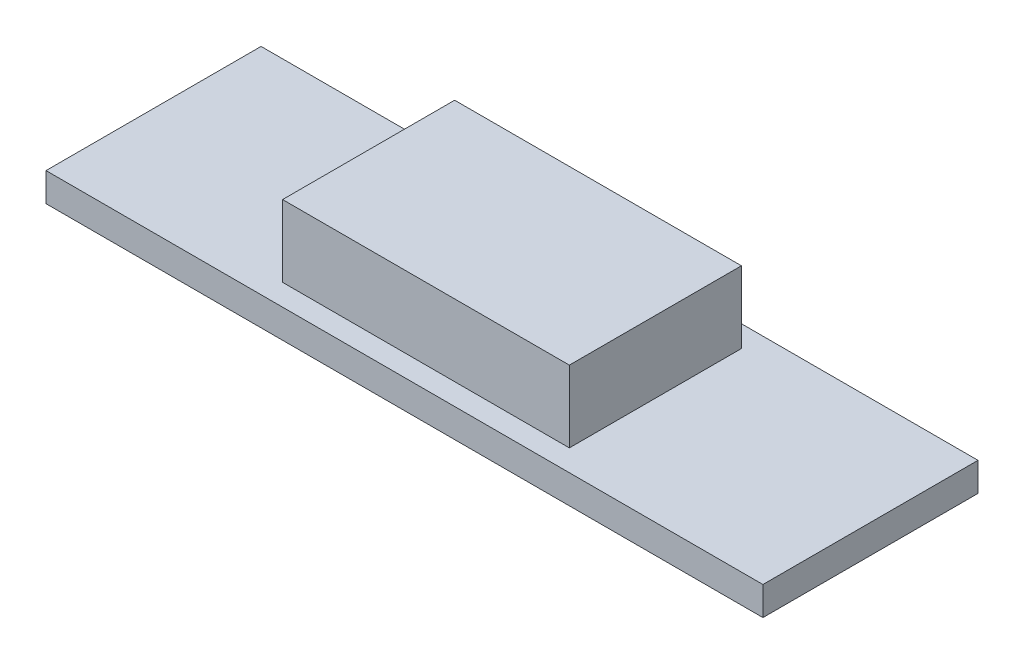
ISO-10303-21;
HEADER;
FILE_DESCRIPTION(('STEP AP214'),'2;1');
FILE_NAME('part.step','',(''),(''),'','','');
FILE_SCHEMA(('AUTOMOTIVE_DESIGN { 1 0 10303 214 1 1 1 1 }'));
ENDSEC;
DATA;
#1=APPLICATION_CONTEXT('core data for automotive mechanical design processes');
#2=APPLICATION_PROTOCOL_DEFINITION('international standard','automotive_design',2000,#1);
#3=PRODUCT_CONTEXT('',#1,'mechanical');
#4=PRODUCT('Part','Part','',(#3));
#5=PRODUCT_RELATED_PRODUCT_CATEGORY('part','',(#4));
#6=PRODUCT_DEFINITION_FORMATION('','',#4);
#7=PRODUCT_DEFINITION_CONTEXT('part definition',#1,'design');
#8=PRODUCT_DEFINITION('design','',#6,#7);
#9=PRODUCT_DEFINITION_SHAPE('','',#8);
#10=(LENGTH_UNIT() NAMED_UNIT(*) SI_UNIT(.MILLI.,.METRE.));
#11=(NAMED_UNIT(*) PLANE_ANGLE_UNIT() SI_UNIT($,.RADIAN.));
#12=(NAMED_UNIT(*) SI_UNIT($,.STERADIAN.) SOLID_ANGLE_UNIT());
#13=UNCERTAINTY_MEASURE_WITH_UNIT(LENGTH_MEASURE(1.E-05),#10,'distance_accuracy_value','');
#14=(GEOMETRIC_REPRESENTATION_CONTEXT(3) GLOBAL_UNCERTAINTY_ASSIGNED_CONTEXT((#13)) GLOBAL_UNIT_ASSIGNED_CONTEXT((#10,
#11,#12)) REPRESENTATION_CONTEXT('',''));
#15=CARTESIAN_POINT('',(0.,0.,0.));
#16=DIRECTION('',(0.,0.,1.));
#17=DIRECTION('',(1.,0.,0.));
#18=AXIS2_PLACEMENT_3D('',#15,#16,#17);
#19=CARTESIAN_POINT('',(-10.,5.,6.));
#20=DIRECTION('',(1.,0.,0.));
#21=DIRECTION('',(0.,0.,-1.));
#22=AXIS2_PLACEMENT_3D('',#19,#20,#21);
#23=PLANE('',#22);
#24=DIRECTION('',(0.,0.,1.));
#25=VECTOR('',#24,1.);
#26=CARTESIAN_POINT('',(-10.,0.,6.));
#27=LINE('',#26,#25);
#28=CARTESIAN_POINT('',(-10.,0.,-6.));
#29=VERTEX_POINT('',#28);
#30=CARTESIAN_POINT('',(-10.,0.,6.));
#31=VERTEX_POINT('',#30);
#32=EDGE_CURVE('E118',#29,#31,#27,.T.);
#33=ORIENTED_EDGE('',*,*,#32,.T.);
#34=DIRECTION('',(0.,-1.,0.));
#35=VECTOR('',#34,1.);
#36=CARTESIAN_POINT('',(-10.,5.,6.));
#37=LINE('',#36,#35);
#38=CARTESIAN_POINT('',(-10.,5.,6.));
#39=VERTEX_POINT('',#38);
#40=EDGE_CURVE('E11',#39,#31,#37,.T.);
#41=ORIENTED_EDGE('',*,*,#40,.F.);
#42=DIRECTION('',(0.,0.,1.));
#43=VECTOR('',#42,1.);
#44=CARTESIAN_POINT('',(-10.,5.,6.));
#45=LINE('',#44,#43);
#46=CARTESIAN_POINT('',(-10.,5.,-6.));
#47=VERTEX_POINT('',#46);
#48=EDGE_CURVE('E127',#47,#39,#45,.T.);
#49=ORIENTED_EDGE('',*,*,#48,.F.);
#50=DIRECTION('',(0.,-1.,0.));
#51=VECTOR('',#50,1.);
#52=CARTESIAN_POINT('',(-10.,5.,-6.));
#53=LINE('',#52,#51);
#54=EDGE_CURVE('E134',#47,#29,#53,.T.);
#55=ORIENTED_EDGE('',*,*,#54,.T.);
#56=EDGE_LOOP('',(#33,#41,#49,#55));
#57=FACE_BOUND('',#56,.T.);
#58=ADVANCED_FACE('F33',(#57),#23,.F.);
#59=CARTESIAN_POINT('',(10.,5.,6.));
#60=DIRECTION('',(0.,0.,-1.));
#61=DIRECTION('',(-1.,0.,0.));
#62=AXIS2_PLACEMENT_3D('',#59,#60,#61);
#63=PLANE('',#62);
#64=DIRECTION('',(1.,0.,0.));
#65=VECTOR('',#64,1.);
#66=CARTESIAN_POINT('',(10.,0.,6.));
#67=LINE('',#66,#65);
#68=CARTESIAN_POINT('',(10.,0.,6.));
#69=VERTEX_POINT('',#68);
#70=EDGE_CURVE('E121',#31,#69,#67,.T.);
#71=ORIENTED_EDGE('',*,*,#70,.T.);
#72=DIRECTION('',(0.,-1.,0.));
#73=VECTOR('',#72,1.);
#74=CARTESIAN_POINT('',(10.,5.,6.));
#75=LINE('',#74,#73);
#76=CARTESIAN_POINT('',(10.,5.,6.));
#77=VERTEX_POINT('',#76);
#78=EDGE_CURVE('E41',#77,#69,#75,.T.);
#79=ORIENTED_EDGE('',*,*,#78,.F.);
#80=DIRECTION('',(1.,0.,0.));
#81=VECTOR('',#80,1.);
#82=CARTESIAN_POINT('',(10.,5.,6.));
#83=LINE('',#82,#81);
#84=EDGE_CURVE('E129',#39,#77,#83,.T.);
#85=ORIENTED_EDGE('',*,*,#84,.F.);
#86=ORIENTED_EDGE('',*,*,#40,.T.);
#87=EDGE_LOOP('',(#71,#79,#85,#86));
#88=FACE_BOUND('',#87,.T.);
#89=ADVANCED_FACE('F155',(#88),#63,.F.);
#90=CARTESIAN_POINT('',(10.,5.,6.));
#91=DIRECTION('',(-1.,0.,0.));
#92=DIRECTION('',(0.,0.,1.));
#93=AXIS2_PLACEMENT_3D('',#90,#91,#92);
#94=PLANE('',#93);
#95=DIRECTION('',(0.,0.,-1.));
#96=VECTOR('',#95,1.);
#97=CARTESIAN_POINT('',(10.,0.,6.));
#98=LINE('',#97,#96);
#99=CARTESIAN_POINT('',(10.,0.,-6.));
#100=VERTEX_POINT('',#99);
#101=EDGE_CURVE('E138',#69,#100,#98,.T.);
#102=ORIENTED_EDGE('',*,*,#101,.T.);
#103=DIRECTION('',(0.,-1.,0.));
#104=VECTOR('',#103,1.);
#105=CARTESIAN_POINT('',(10.,5.,-6.));
#106=LINE('',#105,#104);
#107=CARTESIAN_POINT('',(10.,5.,-6.));
#108=VERTEX_POINT('',#107);
#109=EDGE_CURVE('E145',#108,#100,#106,.T.);
#110=ORIENTED_EDGE('',*,*,#109,.F.);
#111=DIRECTION('',(0.,0.,-1.));
#112=VECTOR('',#111,1.);
#113=CARTESIAN_POINT('',(10.,5.,6.));
#114=LINE('',#113,#112);
#115=EDGE_CURVE('E132',#77,#108,#114,.T.);
#116=ORIENTED_EDGE('',*,*,#115,.F.);
#117=ORIENTED_EDGE('',*,*,#78,.T.);
#118=EDGE_LOOP('',(#102,#110,#116,#117));
#119=FACE_BOUND('',#118,.T.);
#120=ADVANCED_FACE('F151',(#119),#94,.F.);
#121=CARTESIAN_POINT('',(10.,5.,-6.));
#122=DIRECTION('',(0.,0.,1.));
#123=DIRECTION('',(1.,0.,0.));
#124=AXIS2_PLACEMENT_3D('',#121,#122,#123);
#125=PLANE('',#124);
#126=DIRECTION('',(-1.,0.,0.));
#127=VECTOR('',#126,1.);
#128=CARTESIAN_POINT('',(10.,0.,-6.));
#129=LINE('',#128,#127);
#130=EDGE_CURVE('E130',#100,#29,#129,.T.);
#131=ORIENTED_EDGE('',*,*,#130,.T.);
#132=ORIENTED_EDGE('',*,*,#54,.F.);
#133=DIRECTION('',(-1.,0.,0.));
#134=VECTOR('',#133,1.);
#135=CARTESIAN_POINT('',(10.,5.,-6.));
#136=LINE('',#135,#134);
#137=EDGE_CURVE('E48',#108,#47,#136,.T.);
#138=ORIENTED_EDGE('',*,*,#137,.F.);
#139=ORIENTED_EDGE('',*,*,#109,.T.);
#140=EDGE_LOOP('',(#131,#132,#138,#139));
#141=FACE_BOUND('',#140,.T.);
#142=ADVANCED_FACE('F161',(#141),#125,.F.);
#143=CARTESIAN_POINT('',(0.,5.,0.));
#144=DIRECTION('',(0.,1.,0.));
#145=DIRECTION('',(0.,0.,1.));
#146=AXIS2_PLACEMENT_3D('',#143,#144,#145);
#147=PLANE('',#146);
#148=ORIENTED_EDGE('',*,*,#48,.T.);
#149=ORIENTED_EDGE('',*,*,#84,.T.);
#150=ORIENTED_EDGE('',*,*,#115,.T.);
#151=ORIENTED_EDGE('',*,*,#137,.T.);
#152=EDGE_LOOP('',(#148,#149,#150,#151));
#153=FACE_BOUND('',#152,.T.);
#154=ADVANCED_FACE('F164',(#153),#147,.T.);
#155=CARTESIAN_POINT('',(-25.,-2.,-7.5));
#156=DIRECTION('',(1.,0.,0.));
#157=DIRECTION('',(0.,0.,-1.));
#158=AXIS2_PLACEMENT_3D('',#155,#156,#157);
#159=PLANE('',#158);
#160=DIRECTION('',(0.,0.,-1.));
#161=VECTOR('',#160,1.);
#162=CARTESIAN_POINT('',(-25.,0.,-7.5));
#163=LINE('',#162,#161);
#164=CARTESIAN_POINT('',(-25.,0.,7.5));
#165=VERTEX_POINT('',#164);
#166=CARTESIAN_POINT('',(-25.,0.,-7.5));
#167=VERTEX_POINT('',#166);
#168=EDGE_CURVE('E117',#165,#167,#163,.T.);
#169=ORIENTED_EDGE('',*,*,#168,.T.);
#170=DIRECTION('',(0.,1.,0.));
#171=VECTOR('',#170,1.);
#172=CARTESIAN_POINT('',(-25.,-2.,-7.5));
#173=LINE('',#172,#171);
#174=CARTESIAN_POINT('',(-25.,-2.,-7.5));
#175=VERTEX_POINT('',#174);
#176=EDGE_CURVE('E97',#175,#167,#173,.T.);
#177=ORIENTED_EDGE('',*,*,#176,.F.);
#178=DIRECTION('',(0.,0.,-1.));
#179=VECTOR('',#178,1.);
#180=CARTESIAN_POINT('',(-25.,-2.,-7.5));
#181=LINE('',#180,#179);
#182=CARTESIAN_POINT('',(-25.,-2.,7.5));
#183=VERTEX_POINT('',#182);
#184=EDGE_CURVE('E104',#183,#175,#181,.T.);
#185=ORIENTED_EDGE('',*,*,#184,.F.);
#186=DIRECTION('',(0.,1.,0.));
#187=VECTOR('',#186,1.);
#188=CARTESIAN_POINT('',(-25.,-2.,7.5));
#189=LINE('',#188,#187);
#190=EDGE_CURVE('E244',#183,#165,#189,.T.);
#191=ORIENTED_EDGE('',*,*,#190,.T.);
#192=EDGE_LOOP('',(#169,#177,#185,#191));
#193=FACE_BOUND('',#192,.T.);
#194=ADVANCED_FACE('F115',(#193),#159,.F.);
#195=CARTESIAN_POINT('',(25.,-2.,-7.5));
#196=DIRECTION('',(0.,0.,1.));
#197=DIRECTION('',(1.,0.,0.));
#198=AXIS2_PLACEMENT_3D('',#195,#196,#197);
#199=PLANE('',#198);
#200=DIRECTION('',(1.,0.,0.));
#201=VECTOR('',#200,1.);
#202=CARTESIAN_POINT('',(25.,0.,-7.5));
#203=LINE('',#202,#201);
#204=CARTESIAN_POINT('',(25.,0.,-7.5));
#205=VERTEX_POINT('',#204);
#206=EDGE_CURVE('E250',#167,#205,#203,.T.);
#207=ORIENTED_EDGE('',*,*,#206,.T.);
#208=DIRECTION('',(0.,1.,0.));
#209=VECTOR('',#208,1.);
#210=CARTESIAN_POINT('',(25.,-2.,-7.5));
#211=LINE('',#210,#209);
#212=CARTESIAN_POINT('',(25.,-2.,-7.5));
#213=VERTEX_POINT('',#212);
#214=EDGE_CURVE('E100',#213,#205,#211,.T.);
#215=ORIENTED_EDGE('',*,*,#214,.F.);
#216=DIRECTION('',(1.,0.,0.));
#217=VECTOR('',#216,1.);
#218=CARTESIAN_POINT('',(25.,-2.,-7.5));
#219=LINE('',#218,#217);
#220=EDGE_CURVE('E93',#175,#213,#219,.T.);
#221=ORIENTED_EDGE('',*,*,#220,.F.);
#222=ORIENTED_EDGE('',*,*,#176,.T.);
#223=EDGE_LOOP('',(#207,#215,#221,#222));
#224=FACE_BOUND('',#223,.T.);
#225=ADVANCED_FACE('F95',(#224),#199,.F.);
#226=CARTESIAN_POINT('',(25.,-2.,-7.5));
#227=DIRECTION('',(-1.,0.,0.));
#228=DIRECTION('',(0.,0.,1.));
#229=AXIS2_PLACEMENT_3D('',#226,#227,#228);
#230=PLANE('',#229);
#231=DIRECTION('',(0.,0.,1.));
#232=VECTOR('',#231,1.);
#233=CARTESIAN_POINT('',(25.,0.,-7.5));
#234=LINE('',#233,#232);
#235=CARTESIAN_POINT('',(25.,0.,7.5));
#236=VERTEX_POINT('',#235);
#237=EDGE_CURVE('E247',#205,#236,#234,.T.);
#238=ORIENTED_EDGE('',*,*,#237,.T.);
#239=DIRECTION('',(0.,1.,0.));
#240=VECTOR('',#239,1.);
#241=CARTESIAN_POINT('',(25.,-2.,7.5));
#242=LINE('',#241,#240);
#243=CARTESIAN_POINT('',(25.,-2.,7.5));
#244=VERTEX_POINT('',#243);
#245=EDGE_CURVE('E123',#244,#236,#242,.T.);
#246=ORIENTED_EDGE('',*,*,#245,.F.);
#247=DIRECTION('',(0.,0.,1.));
#248=VECTOR('',#247,1.);
#249=CARTESIAN_POINT('',(25.,-2.,-7.5));
#250=LINE('',#249,#248);
#251=EDGE_CURVE('E103',#213,#244,#250,.T.);
#252=ORIENTED_EDGE('',*,*,#251,.F.);
#253=ORIENTED_EDGE('',*,*,#214,.T.);
#254=EDGE_LOOP('',(#238,#246,#252,#253));
#255=FACE_BOUND('',#254,.T.);
#256=ADVANCED_FACE('F203',(#255),#230,.F.);
#257=CARTESIAN_POINT('',(25.,-2.,7.5));
#258=DIRECTION('',(0.,0.,-1.));
#259=DIRECTION('',(-1.,0.,0.));
#260=AXIS2_PLACEMENT_3D('',#257,#258,#259);
#261=PLANE('',#260);
#262=DIRECTION('',(-1.,0.,0.));
#263=VECTOR('',#262,1.);
#264=CARTESIAN_POINT('',(25.,0.,7.5));
#265=LINE('',#264,#263);
#266=EDGE_CURVE('E113',#236,#165,#265,.T.);
#267=ORIENTED_EDGE('',*,*,#266,.T.);
#268=ORIENTED_EDGE('',*,*,#190,.F.);
#269=DIRECTION('',(-1.,0.,0.));
#270=VECTOR('',#269,1.);
#271=CARTESIAN_POINT('',(25.,-2.,7.5));
#272=LINE('',#271,#270);
#273=EDGE_CURVE('E109',#244,#183,#272,.T.);
#274=ORIENTED_EDGE('',*,*,#273,.F.);
#275=ORIENTED_EDGE('',*,*,#245,.T.);
#276=EDGE_LOOP('',(#267,#268,#274,#275));
#277=FACE_BOUND('',#276,.T.);
#278=ADVANCED_FACE('F212',(#277),#261,.F.);
#279=CARTESIAN_POINT('',(0.,-2.,0.));
#280=DIRECTION('',(0.,-1.,0.));
#281=DIRECTION('',(0.,0.,-1.));
#282=AXIS2_PLACEMENT_3D('',#279,#280,#281);
#283=PLANE('',#282);
#284=ORIENTED_EDGE('',*,*,#184,.T.);
#285=ORIENTED_EDGE('',*,*,#220,.T.);
#286=ORIENTED_EDGE('',*,*,#251,.T.);
#287=ORIENTED_EDGE('',*,*,#273,.T.);
#288=EDGE_LOOP('',(#284,#285,#286,#287));
#289=FACE_BOUND('',#288,.T.);
#290=ADVANCED_FACE('F107',(#289),#283,.T.);
#291=CARTESIAN_POINT('',(0.,0.,0.));
#292=DIRECTION('',(0.,-1.,0.));
#293=DIRECTION('',(0.,0.,-1.));
#294=AXIS2_PLACEMENT_3D('',#291,#292,#293);
#295=PLANE('',#294);
#296=ORIENTED_EDGE('',*,*,#32,.F.);
#297=ORIENTED_EDGE('',*,*,#130,.F.);
#298=ORIENTED_EDGE('',*,*,#101,.F.);
#299=ORIENTED_EDGE('',*,*,#70,.F.);
#300=EDGE_LOOP('',(#296,#297,#298,#299));
#301=FACE_BOUND('',#300,.T.);
#302=ORIENTED_EDGE('',*,*,#168,.F.);
#303=ORIENTED_EDGE('',*,*,#266,.F.);
#304=ORIENTED_EDGE('',*,*,#237,.F.);
#305=ORIENTED_EDGE('',*,*,#206,.F.);
#306=EDGE_LOOP('',(#302,#303,#304,#305));
#307=FACE_BOUND('',#306,.T.);
#308=ADVANCED_FACE('F158',(#301,#307),#295,.F.);
#309=CLOSED_SHELL('',(#58,#89,#120,#142,#154,#194,#225,#256,#278,#290,#308));
#310=MANIFOLD_SOLID_BREP('B2',#309);
#311=ADVANCED_BREP_SHAPE_REPRESENTATION('',(#18,#310),#14);
#312=SHAPE_DEFINITION_REPRESENTATION(#9,#311);
ENDSEC;
END-ISO-10303-21;
